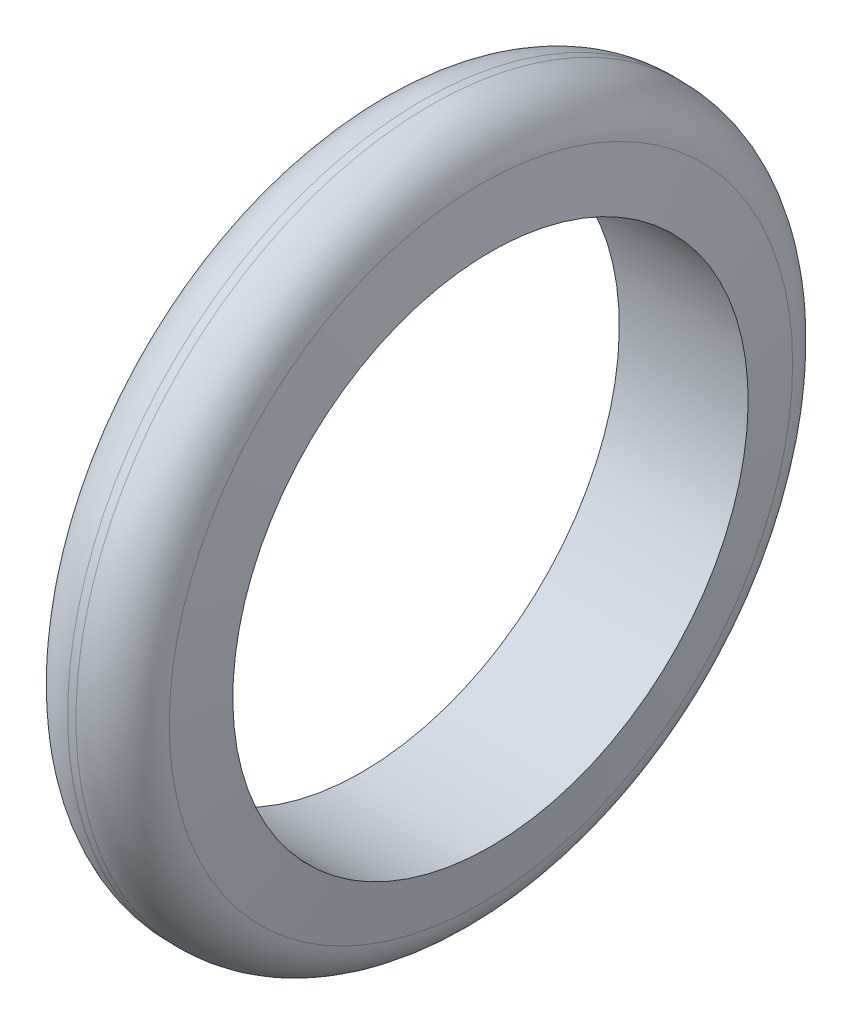
ISO-10303-21;
HEADER;
FILE_DESCRIPTION(('STEP AP214'),'2;1');
FILE_NAME('part.step','',(''),(''),'','','');
FILE_SCHEMA(('AUTOMOTIVE_DESIGN { 1 0 10303 214 1 1 1 1 }'));
ENDSEC;
DATA;
#1=APPLICATION_CONTEXT('core data for automotive mechanical design processes');
#2=APPLICATION_PROTOCOL_DEFINITION('international standard','automotive_design',2000,#1);
#3=PRODUCT_CONTEXT('',#1,'mechanical');
#4=PRODUCT('Part','Part','',(#3));
#5=PRODUCT_RELATED_PRODUCT_CATEGORY('part','',(#4));
#6=PRODUCT_DEFINITION_FORMATION('','',#4);
#7=PRODUCT_DEFINITION_CONTEXT('part definition',#1,'design');
#8=PRODUCT_DEFINITION('design','',#6,#7);
#9=PRODUCT_DEFINITION_SHAPE('','',#8);
#10=(LENGTH_UNIT() NAMED_UNIT(*) SI_UNIT(.MILLI.,.METRE.));
#11=(NAMED_UNIT(*) PLANE_ANGLE_UNIT() SI_UNIT($,.RADIAN.));
#12=(NAMED_UNIT(*) SI_UNIT($,.STERADIAN.) SOLID_ANGLE_UNIT());
#13=UNCERTAINTY_MEASURE_WITH_UNIT(LENGTH_MEASURE(1.E-05),#10,'distance_accuracy_value','');
#14=(GEOMETRIC_REPRESENTATION_CONTEXT(3) GLOBAL_UNCERTAINTY_ASSIGNED_CONTEXT((#13)) GLOBAL_UNIT_ASSIGNED_CONTEXT((#10,
#11,#12)) REPRESENTATION_CONTEXT('',''));
#15=CARTESIAN_POINT('',(0.,0.,0.));
#16=DIRECTION('',(0.,0.,1.));
#17=DIRECTION('',(1.,0.,0.));
#18=AXIS2_PLACEMENT_3D('',#15,#16,#17);
#19=CARTESIAN_POINT('',(-7.35509528937313,0.,0.));
#20=DIRECTION('',(1.,0.,0.));
#21=DIRECTION('',(0.,1.,0.));
#22=AXIS2_PLACEMENT_3D('',#19,#20,#21);
#23=CONICAL_SURFACE('',#22,55.,1.39626340159547);
#24=CARTESIAN_POINT('',(-8.52076026405252,0.,0.));
#25=DIRECTION('',(-1.,0.,0.));
#26=DIRECTION('',(0.,-1.,0.));
#27=AXIS2_PLACEMENT_3D('',#24,#25,#26);
#28=CIRCLE('',#27,48.3891854213354);
#29=CARTESIAN_POINT('',(-8.52076026405252,-48.3891854213354,0.));
#30=VERTEX_POINT('',#29);
#31=EDGE_CURVE('E50',#30,#30,#28,.T.);
#32=ORIENTED_EDGE('',*,*,#31,.T.);
#33=EDGE_LOOP('',(#32));
#34=FACE_BOUND('',#33,.T.);
#35=CARTESIAN_POINT('',(-10.,0.,0.));
#36=DIRECTION('',(-1.,0.,0.));
#37=DIRECTION('',(0.,-1.,0.));
#38=AXIS2_PLACEMENT_3D('',#35,#36,#37);
#39=CIRCLE('',#38,40.);
#40=CARTESIAN_POINT('',(-10.,-40.,0.));
#41=VERTEX_POINT('',#40);
#42=EDGE_CURVE('E55',#41,#41,#39,.T.);
#43=ORIENTED_EDGE('',*,*,#42,.F.);
#44=EDGE_LOOP('',(#43));
#45=FACE_BOUND('',#44,.T.);
#46=ADVANCED_FACE('F35',(#34,#45),#23,.T.);
#47=CARTESIAN_POINT('',(0.,0.,0.));
#48=DIRECTION('',(-1.,0.,0.));
#49=DIRECTION('',(0.,-1.,0.));
#50=AXIS2_PLACEMENT_3D('',#47,#48,#49);
#51=CYLINDRICAL_SURFACE('',#50,40.);
#52=CARTESIAN_POINT('',(10.,0.,0.));
#53=DIRECTION('',(-1.,0.,0.));
#54=DIRECTION('',(0.,-1.,0.));
#55=AXIS2_PLACEMENT_3D('',#52,#53,#54);
#56=CIRCLE('',#55,40.);
#57=CARTESIAN_POINT('',(10.,-40.,0.));
#58=VERTEX_POINT('',#57);
#59=EDGE_CURVE('E58',#58,#58,#56,.T.);
#60=ORIENTED_EDGE('',*,*,#59,.F.);
#61=EDGE_LOOP('',(#60));
#62=FACE_BOUND('',#61,.T.);
#63=ORIENTED_EDGE('',*,*,#42,.T.);
#64=EDGE_LOOP('',(#63));
#65=FACE_BOUND('',#64,.T.);
#66=ADVANCED_FACE('F64',(#62,#65),#51,.F.);
#67=CARTESIAN_POINT('',(10.,0.,0.));
#68=DIRECTION('',(-1.,0.,0.));
#69=DIRECTION('',(0.,-1.,0.));
#70=AXIS2_PLACEMENT_3D('',#67,#68,#69);
#71=CONICAL_SURFACE('',#70,40.,1.39626340159547);
#72=CARTESIAN_POINT('',(8.52076026405252,0.,0.));
#73=DIRECTION('',(1.,0.,0.));
#74=DIRECTION('',(0.,1.,0.));
#75=AXIS2_PLACEMENT_3D('',#72,#73,#74);
#76=CIRCLE('',#75,48.3891854213354);
#77=CARTESIAN_POINT('',(8.52076026405252,48.3891854213354,0.));
#78=VERTEX_POINT('',#77);
#79=EDGE_CURVE('E10',#78,#78,#76,.T.);
#80=ORIENTED_EDGE('',*,*,#79,.T.);
#81=EDGE_LOOP('',(#80));
#82=FACE_BOUND('',#81,.T.);
#83=ORIENTED_EDGE('',*,*,#59,.T.);
#84=EDGE_LOOP('',(#83));
#85=FACE_BOUND('',#84,.T.);
#86=ADVANCED_FACE('F62',(#82,#85),#71,.T.);
#87=CARTESIAN_POINT('',(0.,0.,0.));
#88=DIRECTION('',(-1.,0.,0.));
#89=DIRECTION('',(0.,-1.,0.));
#90=AXIS2_PLACEMENT_3D('',#87,#88,#89);
#91=CYLINDRICAL_SURFACE('',#90,55.);
#92=CARTESIAN_POINT('',(-0.642298239954846,0.,0.));
#93=DIRECTION('',(1.,0.,0.));
#94=DIRECTION('',(0.,1.,0.));
#95=AXIS2_PLACEMENT_3D('',#92,#93,#94);
#96=CIRCLE('',#95,55.);
#97=CARTESIAN_POINT('',(-0.642298239954846,55.,0.));
#98=VERTEX_POINT('',#97);
#99=EDGE_CURVE('E42',#98,#98,#96,.T.);
#100=ORIENTED_EDGE('',*,*,#99,.T.);
#101=EDGE_LOOP('',(#100));
#102=FACE_BOUND('',#101,.T.);
#103=CARTESIAN_POINT('',(0.642298239954847,0.,0.));
#104=DIRECTION('',(1.,0.,0.));
#105=DIRECTION('',(0.,1.,0.));
#106=AXIS2_PLACEMENT_3D('',#103,#104,#105);
#107=CIRCLE('',#106,55.);
#108=CARTESIAN_POINT('',(0.642298239954847,55.,0.));
#109=VERTEX_POINT('',#108);
#110=EDGE_CURVE('E46',#109,#109,#107,.F.);
#111=ORIENTED_EDGE('',*,*,#110,.T.);
#112=EDGE_LOOP('',(#111));
#113=FACE_BOUND('',#112,.T.);
#114=ADVANCED_FACE('F78',(#102,#113),#91,.T.);
#115=CARTESIAN_POINT('',(-0.642298239954845,0.,0.));
#116=DIRECTION('',(1.,0.,0.));
#117=DIRECTION('',(0.,1.,0.));
#118=AXIS2_PLACEMENT_3D('',#115,#116,#117);
#119=TOROIDAL_SURFACE('',#118,47.,8.);
#120=ORIENTED_EDGE('',*,*,#99,.F.);
#121=EDGE_LOOP('',(#120));
#122=FACE_BOUND('',#121,.T.);
#123=ORIENTED_EDGE('',*,*,#31,.F.);
#124=EDGE_LOOP('',(#123));
#125=FACE_BOUND('',#124,.T.);
#126=ADVANCED_FACE('F76',(#122,#125),#119,.T.);
#127=CARTESIAN_POINT('',(0.642298239954847,0.,0.));
#128=DIRECTION('',(1.,0.,0.));
#129=DIRECTION('',(0.,1.,0.));
#130=AXIS2_PLACEMENT_3D('',#127,#128,#129);
#131=TOROIDAL_SURFACE('',#130,47.,8.);
#132=ORIENTED_EDGE('',*,*,#79,.F.);
#133=EDGE_LOOP('',(#132));
#134=FACE_BOUND('',#133,.T.);
#135=ORIENTED_EDGE('',*,*,#110,.F.);
#136=EDGE_LOOP('',(#135));
#137=FACE_BOUND('',#136,.T.);
#138=ADVANCED_FACE('F37',(#134,#137),#131,.T.);
#139=CLOSED_SHELL('',(#46,#66,#86,#114,#126,#138));
#140=MANIFOLD_SOLID_BREP('B2',#139);
#141=ADVANCED_BREP_SHAPE_REPRESENTATION('',(#18,#140),#14);
#142=SHAPE_DEFINITION_REPRESENTATION(#9,#141);
ENDSEC;
END-ISO-10303-21;
